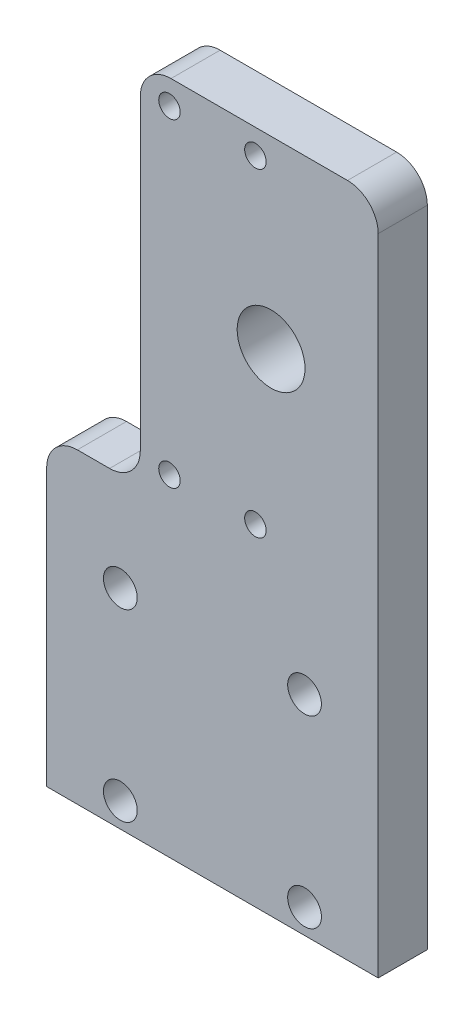
ISO-10303-21;
HEADER;
FILE_DESCRIPTION(('STEP AP214'),'2;1');
FILE_NAME('part.step','',(''),(''),'','','');
FILE_SCHEMA(('AUTOMOTIVE_DESIGN { 1 0 10303 214 1 1 1 1 }'));
ENDSEC;
DATA;
#1=APPLICATION_CONTEXT('core data for automotive mechanical design processes');
#2=APPLICATION_PROTOCOL_DEFINITION('international standard','automotive_design',2000,#1);
#3=PRODUCT_CONTEXT('',#1,'mechanical');
#4=PRODUCT('Part','Part','',(#3));
#5=PRODUCT_RELATED_PRODUCT_CATEGORY('part','',(#4));
#6=PRODUCT_DEFINITION_FORMATION('','',#4);
#7=PRODUCT_DEFINITION_CONTEXT('part definition',#1,'design');
#8=PRODUCT_DEFINITION('design','',#6,#7);
#9=PRODUCT_DEFINITION_SHAPE('','',#8);
#10=(LENGTH_UNIT() NAMED_UNIT(*) SI_UNIT(.MILLI.,.METRE.));
#11=(NAMED_UNIT(*) PLANE_ANGLE_UNIT() SI_UNIT($,.RADIAN.));
#12=(NAMED_UNIT(*) SI_UNIT($,.STERADIAN.) SOLID_ANGLE_UNIT());
#13=UNCERTAINTY_MEASURE_WITH_UNIT(LENGTH_MEASURE(1.E-05),#10,'distance_accuracy_value','');
#14=(GEOMETRIC_REPRESENTATION_CONTEXT(3) GLOBAL_UNCERTAINTY_ASSIGNED_CONTEXT((#13)) GLOBAL_UNIT_ASSIGNED_CONTEXT((#10,
#11,#12)) REPRESENTATION_CONTEXT('',''));
#15=CARTESIAN_POINT('',(0.,0.,0.));
#16=DIRECTION('',(0.,0.,1.));
#17=DIRECTION('',(1.,0.,0.));
#18=AXIS2_PLACEMENT_3D('',#15,#16,#17);
#19=CARTESIAN_POINT('',(0.,0.,8.));
#20=DIRECTION('',(0.,0.,1.));
#21=DIRECTION('',(1.,0.,0.));
#22=AXIS2_PLACEMENT_3D('',#19,#20,#21);
#23=PLANE('',#22);
#24=CARTESIAN_POINT('',(36.55,-30.,8.));
#25=DIRECTION('',(0.,0.,1.));
#26=DIRECTION('',(1.,0.,0.));
#27=AXIS2_PLACEMENT_3D('',#24,#25,#26);
#28=CIRCLE('',#27,5.525);
#29=CARTESIAN_POINT('',(42.075,-30.,8.));
#30=VERTEX_POINT('',#29);
#31=EDGE_CURVE('E291',#30,#30,#28,.T.);
#32=ORIENTED_EDGE('',*,*,#31,.F.);
#33=EDGE_LOOP('',(#32));
#34=FACE_BOUND('',#33,.T.);
#35=CARTESIAN_POINT('',(19.9999999999996,-56.,8.));
#36=DIRECTION('',(0.,0.,-1.));
#37=DIRECTION('',(-1.,0.,0.));
#38=AXIS2_PLACEMENT_3D('',#35,#36,#37);
#39=CIRCLE('',#38,1.75);
#40=CARTESIAN_POINT('',(18.2499999999996,-56.,8.));
#41=VERTEX_POINT('',#40);
#42=EDGE_CURVE('E290',#41,#41,#39,.T.);
#43=ORIENTED_EDGE('',*,*,#42,.T.);
#44=EDGE_LOOP('',(#43));
#45=FACE_BOUND('',#44,.T.);
#46=CARTESIAN_POINT('',(33.9999999999996,-56.0000000000001,8.));
#47=DIRECTION('',(0.,0.,-1.));
#48=DIRECTION('',(-1.,0.,0.));
#49=AXIS2_PLACEMENT_3D('',#46,#47,#48);
#50=CIRCLE('',#49,1.75);
#51=CARTESIAN_POINT('',(32.2499999999996,-56.0000000000001,8.));
#52=VERTEX_POINT('',#51);
#53=EDGE_CURVE('E297',#52,#52,#50,.T.);
#54=ORIENTED_EDGE('',*,*,#53,.T.);
#55=EDGE_LOOP('',(#54));
#56=FACE_BOUND('',#55,.T.);
#57=CARTESIAN_POINT('',(34.0000000000001,-4.0000000000001,8.));
#58=DIRECTION('',(0.,0.,-1.));
#59=DIRECTION('',(-1.,0.,0.));
#60=AXIS2_PLACEMENT_3D('',#57,#58,#59);
#61=CIRCLE('',#60,1.75);
#62=CARTESIAN_POINT('',(32.2500000000001,-4.0000000000001,8.));
#63=VERTEX_POINT('',#62);
#64=EDGE_CURVE('E284',#63,#63,#61,.T.);
#65=ORIENTED_EDGE('',*,*,#64,.T.);
#66=EDGE_LOOP('',(#65));
#67=FACE_BOUND('',#66,.T.);
#68=CARTESIAN_POINT('',(20.0000000000001,-4.,8.));
#69=DIRECTION('',(0.,0.,-1.));
#70=DIRECTION('',(-1.,0.,0.));
#71=AXIS2_PLACEMENT_3D('',#68,#69,#70);
#72=CIRCLE('',#71,1.75);
#73=CARTESIAN_POINT('',(18.2500000000001,-4.,8.));
#74=VERTEX_POINT('',#73);
#75=EDGE_CURVE('E185',#74,#74,#72,.T.);
#76=ORIENTED_EDGE('',*,*,#75,.T.);
#77=EDGE_LOOP('',(#76));
#78=FACE_BOUND('',#77,.T.);
#79=DIRECTION('',(1.,0.,0.));
#80=VECTOR('',#79,1.);
#81=CARTESIAN_POINT('',(0.,-60.,8.));
#82=LINE('',#81,#80);
#83=CARTESIAN_POINT('',(5.00000000000001,-60.,8.));
#84=VERTEX_POINT('',#83);
#85=CARTESIAN_POINT('',(10.25,-60.,8.));
#86=VERTEX_POINT('',#85);
#87=EDGE_CURVE('E189',#84,#86,#82,.T.);
#88=ORIENTED_EDGE('',*,*,#87,.F.);
#89=CARTESIAN_POINT('',(5.00000000000001,-65.,8.));
#90=DIRECTION('',(0.,0.,1.));
#91=DIRECTION('',(1.,0.,0.));
#92=AXIS2_PLACEMENT_3D('',#89,#90,#91);
#93=CIRCLE('',#92,5.);
#94=CARTESIAN_POINT('',(0.,-65.,8.));
#95=VERTEX_POINT('',#94);
#96=EDGE_CURVE('E119',#84,#95,#93,.T.);
#97=ORIENTED_EDGE('',*,*,#96,.T.);
#98=DIRECTION('',(0.,-1.,0.));
#99=VECTOR('',#98,1.);
#100=CARTESIAN_POINT('',(0.,0.,8.));
#101=LINE('',#100,#99);
#102=CARTESIAN_POINT('',(0.,-110.,8.));
#103=VERTEX_POINT('',#102);
#104=EDGE_CURVE('E111',#95,#103,#101,.T.);
#105=ORIENTED_EDGE('',*,*,#104,.T.);
#106=DIRECTION('',(1.,0.,0.));
#107=VECTOR('',#106,1.);
#108=CARTESIAN_POINT('',(0.,-110.,8.));
#109=LINE('',#108,#107);
#110=CARTESIAN_POINT('',(54.,-110.,8.));
#111=VERTEX_POINT('',#110);
#112=EDGE_CURVE('E116',#103,#111,#109,.T.);
#113=ORIENTED_EDGE('',*,*,#112,.T.);
#114=DIRECTION('',(0.,1.,0.));
#115=VECTOR('',#114,1.);
#116=CARTESIAN_POINT('',(54.,-52.,8.));
#117=LINE('',#116,#115);
#118=CARTESIAN_POINT('',(54.,-5.00000000000001,8.));
#119=VERTEX_POINT('',#118);
#120=EDGE_CURVE('E134',#111,#119,#117,.T.);
#121=ORIENTED_EDGE('',*,*,#120,.T.);
#122=CARTESIAN_POINT('',(49.,-5.,8.));
#123=DIRECTION('',(0.,0.,1.));
#124=DIRECTION('',(1.,0.,0.));
#125=AXIS2_PLACEMENT_3D('',#122,#123,#124);
#126=CIRCLE('',#125,5.);
#127=CARTESIAN_POINT('',(49.,0.,8.));
#128=VERTEX_POINT('',#127);
#129=EDGE_CURVE('E159',#119,#128,#126,.T.);
#130=ORIENTED_EDGE('',*,*,#129,.T.);
#131=DIRECTION('',(-1.,0.,0.));
#132=VECTOR('',#131,1.);
#133=CARTESIAN_POINT('',(0.,0.,8.));
#134=LINE('',#133,#132);
#135=CARTESIAN_POINT('',(20.25,0.,8.));
#136=VERTEX_POINT('',#135);
#137=EDGE_CURVE('E144',#128,#136,#134,.T.);
#138=ORIENTED_EDGE('',*,*,#137,.T.);
#139=CARTESIAN_POINT('',(20.25,-5.,8.));
#140=DIRECTION('',(0.,0.,1.));
#141=DIRECTION('',(1.,0.,0.));
#142=AXIS2_PLACEMENT_3D('',#139,#140,#141);
#143=CIRCLE('',#142,5.);
#144=CARTESIAN_POINT('',(15.25,-5.,8.));
#145=VERTEX_POINT('',#144);
#146=EDGE_CURVE('E51',#136,#145,#143,.T.);
#147=ORIENTED_EDGE('',*,*,#146,.T.);
#148=DIRECTION('',(0.,1.,0.));
#149=VECTOR('',#148,1.);
#150=CARTESIAN_POINT('',(15.25,0.,8.));
#151=LINE('',#150,#149);
#152=CARTESIAN_POINT('',(15.25,-55.,8.));
#153=VERTEX_POINT('',#152);
#154=EDGE_CURVE('E190',#153,#145,#151,.T.);
#155=ORIENTED_EDGE('',*,*,#154,.F.);
#156=CARTESIAN_POINT('',(10.25,-55.,8.));
#157=DIRECTION('',(0.,0.,1.));
#158=DIRECTION('',(1.,0.,0.));
#159=AXIS2_PLACEMENT_3D('',#156,#157,#158);
#160=CIRCLE('',#159,5.);
#161=EDGE_CURVE('E11',#153,#86,#160,.F.);
#162=ORIENTED_EDGE('',*,*,#161,.T.);
#163=EDGE_LOOP('',(#88,#97,#105,#113,#121,#130,#138,#147,#155,#162));
#164=FACE_BOUND('',#163,.T.);
#165=CARTESIAN_POINT('',(41.9999999999999,-76.,8.));
#166=DIRECTION('',(0.,0.,1.));
#167=DIRECTION('',(1.,0.,0.));
#168=AXIS2_PLACEMENT_3D('',#165,#166,#167);
#169=CIRCLE('',#168,2.75);
#170=CARTESIAN_POINT('',(44.7499999999999,-76.,8.));
#171=VERTEX_POINT('',#170);
#172=EDGE_CURVE('E205',#171,#171,#169,.T.);
#173=ORIENTED_EDGE('',*,*,#172,.F.);
#174=EDGE_LOOP('',(#173));
#175=FACE_BOUND('',#174,.T.);
#176=CARTESIAN_POINT('',(12.,-106.,8.));
#177=DIRECTION('',(0.,0.,1.));
#178=DIRECTION('',(1.,0.,0.));
#179=AXIS2_PLACEMENT_3D('',#176,#177,#178);
#180=CIRCLE('',#179,2.75);
#181=CARTESIAN_POINT('',(14.75,-106.,8.));
#182=VERTEX_POINT('',#181);
#183=EDGE_CURVE('E217',#182,#182,#180,.T.);
#184=ORIENTED_EDGE('',*,*,#183,.F.);
#185=EDGE_LOOP('',(#184));
#186=FACE_BOUND('',#185,.T.);
#187=CARTESIAN_POINT('',(42.,-106.,8.));
#188=DIRECTION('',(0.,0.,1.));
#189=DIRECTION('',(1.,0.,0.));
#190=AXIS2_PLACEMENT_3D('',#187,#188,#189);
#191=CIRCLE('',#190,2.75);
#192=CARTESIAN_POINT('',(44.75,-106.,8.));
#193=VERTEX_POINT('',#192);
#194=EDGE_CURVE('E211',#193,#193,#191,.T.);
#195=ORIENTED_EDGE('',*,*,#194,.F.);
#196=EDGE_LOOP('',(#195));
#197=FACE_BOUND('',#196,.T.);
#198=CARTESIAN_POINT('',(11.9999999999999,-76.,8.));
#199=DIRECTION('',(0.,0.,1.));
#200=DIRECTION('',(1.,0.,0.));
#201=AXIS2_PLACEMENT_3D('',#198,#199,#200);
#202=CIRCLE('',#201,2.75);
#203=CARTESIAN_POINT('',(14.7499999999999,-76.,8.));
#204=VERTEX_POINT('',#203);
#205=EDGE_CURVE('E197',#204,#204,#202,.T.);
#206=ORIENTED_EDGE('',*,*,#205,.F.);
#207=EDGE_LOOP('',(#206));
#208=FACE_BOUND('',#207,.T.);
#209=ADVANCED_FACE('F36',(#34,#45,#56,#67,#78,#164,#175,#186,#197,#208),#23,.T.);
#210=CARTESIAN_POINT('',(0.,0.,0.));
#211=DIRECTION('',(0.,0.,1.));
#212=DIRECTION('',(1.,0.,0.));
#213=AXIS2_PLACEMENT_3D('',#210,#211,#212);
#214=PLANE('',#213);
#215=CARTESIAN_POINT('',(36.55,-30.,0.));
#216=DIRECTION('',(0.,0.,-1.));
#217=DIRECTION('',(-1.,0.,0.));
#218=AXIS2_PLACEMENT_3D('',#215,#216,#217);
#219=CIRCLE('',#218,5.525);
#220=CARTESIAN_POINT('',(31.025,-30.,0.));
#221=VERTEX_POINT('',#220);
#222=EDGE_CURVE('E307',#221,#221,#219,.T.);
#223=ORIENTED_EDGE('',*,*,#222,.F.);
#224=EDGE_LOOP('',(#223));
#225=FACE_BOUND('',#224,.T.);
#226=CARTESIAN_POINT('',(19.9999999999996,-56.,0.));
#227=DIRECTION('',(0.,0.,-1.));
#228=DIRECTION('',(-1.,0.,0.));
#229=AXIS2_PLACEMENT_3D('',#226,#227,#228);
#230=CIRCLE('',#229,1.75);
#231=CARTESIAN_POINT('',(18.2499999999996,-56.,0.));
#232=VERTEX_POINT('',#231);
#233=EDGE_CURVE('E287',#232,#232,#230,.T.);
#234=ORIENTED_EDGE('',*,*,#233,.F.);
#235=EDGE_LOOP('',(#234));
#236=FACE_BOUND('',#235,.T.);
#237=CARTESIAN_POINT('',(33.9999999999996,-56.0000000000001,0.));
#238=DIRECTION('',(0.,0.,-1.));
#239=DIRECTION('',(-1.,0.,0.));
#240=AXIS2_PLACEMENT_3D('',#237,#238,#239);
#241=CIRCLE('',#240,1.75);
#242=CARTESIAN_POINT('',(32.2499999999996,-56.0000000000001,0.));
#243=VERTEX_POINT('',#242);
#244=EDGE_CURVE('E294',#243,#243,#241,.T.);
#245=ORIENTED_EDGE('',*,*,#244,.F.);
#246=EDGE_LOOP('',(#245));
#247=FACE_BOUND('',#246,.T.);
#248=CARTESIAN_POINT('',(34.0000000000001,-4.0000000000001,0.));
#249=DIRECTION('',(0.,0.,-1.));
#250=DIRECTION('',(-1.,0.,0.));
#251=AXIS2_PLACEMENT_3D('',#248,#249,#250);
#252=CIRCLE('',#251,1.75);
#253=CARTESIAN_POINT('',(32.2500000000001,-4.0000000000001,0.));
#254=VERTEX_POINT('',#253);
#255=EDGE_CURVE('E300',#254,#254,#252,.T.);
#256=ORIENTED_EDGE('',*,*,#255,.F.);
#257=EDGE_LOOP('',(#256));
#258=FACE_BOUND('',#257,.T.);
#259=CARTESIAN_POINT('',(20.0000000000001,-4.,0.));
#260=DIRECTION('',(0.,0.,-1.));
#261=DIRECTION('',(-1.,0.,0.));
#262=AXIS2_PLACEMENT_3D('',#259,#260,#261);
#263=CIRCLE('',#262,1.75);
#264=CARTESIAN_POINT('',(18.2500000000001,-4.,0.));
#265=VERTEX_POINT('',#264);
#266=EDGE_CURVE('E281',#265,#265,#263,.T.);
#267=ORIENTED_EDGE('',*,*,#266,.F.);
#268=EDGE_LOOP('',(#267));
#269=FACE_BOUND('',#268,.T.);
#270=DIRECTION('',(0.,-1.,0.));
#271=VECTOR('',#270,1.);
#272=CARTESIAN_POINT('',(0.,0.,0.));
#273=LINE('',#272,#271);
#274=CARTESIAN_POINT('',(0.,-65.,0.));
#275=VERTEX_POINT('',#274);
#276=CARTESIAN_POINT('',(0.,-110.,0.));
#277=VERTEX_POINT('',#276);
#278=EDGE_CURVE('E138',#275,#277,#273,.T.);
#279=ORIENTED_EDGE('',*,*,#278,.F.);
#280=CARTESIAN_POINT('',(5.00000000000001,-65.,0.));
#281=DIRECTION('',(0.,0.,1.));
#282=DIRECTION('',(1.,0.,0.));
#283=AXIS2_PLACEMENT_3D('',#280,#281,#282);
#284=CIRCLE('',#283,5.);
#285=CARTESIAN_POINT('',(5.00000000000001,-60.,0.));
#286=VERTEX_POINT('',#285);
#287=EDGE_CURVE('E151',#275,#286,#284,.F.);
#288=ORIENTED_EDGE('',*,*,#287,.T.);
#289=DIRECTION('',(-1.,0.,0.));
#290=VECTOR('',#289,1.);
#291=CARTESIAN_POINT('',(15.25,-60.,0.));
#292=LINE('',#291,#290);
#293=CARTESIAN_POINT('',(10.25,-60.,0.));
#294=VERTEX_POINT('',#293);
#295=EDGE_CURVE('E180',#294,#286,#292,.T.);
#296=ORIENTED_EDGE('',*,*,#295,.F.);
#297=CARTESIAN_POINT('',(10.25,-55.,0.));
#298=DIRECTION('',(0.,0.,1.));
#299=DIRECTION('',(1.,0.,0.));
#300=AXIS2_PLACEMENT_3D('',#297,#298,#299);
#301=CIRCLE('',#300,5.);
#302=CARTESIAN_POINT('',(15.25,-55.,0.));
#303=VERTEX_POINT('',#302);
#304=EDGE_CURVE('E44',#294,#303,#301,.T.);
#305=ORIENTED_EDGE('',*,*,#304,.T.);
#306=DIRECTION('',(0.,-1.,0.));
#307=VECTOR('',#306,1.);
#308=CARTESIAN_POINT('',(15.25,0.,0.));
#309=LINE('',#308,#307);
#310=CARTESIAN_POINT('',(15.25,-5.,0.));
#311=VERTEX_POINT('',#310);
#312=EDGE_CURVE('E177',#311,#303,#309,.T.);
#313=ORIENTED_EDGE('',*,*,#312,.F.);
#314=CARTESIAN_POINT('',(20.25,-5.,0.));
#315=DIRECTION('',(0.,0.,1.));
#316=DIRECTION('',(1.,0.,0.));
#317=AXIS2_PLACEMENT_3D('',#314,#315,#316);
#318=CIRCLE('',#317,5.);
#319=CARTESIAN_POINT('',(20.25,0.,0.));
#320=VERTEX_POINT('',#319);
#321=EDGE_CURVE('E142',#311,#320,#318,.F.);
#322=ORIENTED_EDGE('',*,*,#321,.T.);
#323=DIRECTION('',(-1.,0.,0.));
#324=VECTOR('',#323,1.);
#325=CARTESIAN_POINT('',(0.,0.,0.));
#326=LINE('',#325,#324);
#327=CARTESIAN_POINT('',(49.,0.,0.));
#328=VERTEX_POINT('',#327);
#329=EDGE_CURVE('E124',#328,#320,#326,.T.);
#330=ORIENTED_EDGE('',*,*,#329,.F.);
#331=CARTESIAN_POINT('',(49.,-5.,0.));
#332=DIRECTION('',(0.,0.,1.));
#333=DIRECTION('',(1.,0.,0.));
#334=AXIS2_PLACEMENT_3D('',#331,#332,#333);
#335=CIRCLE('',#334,5.);
#336=CARTESIAN_POINT('',(54.,-5.00000000000001,0.));
#337=VERTEX_POINT('',#336);
#338=EDGE_CURVE('E149',#328,#337,#335,.F.);
#339=ORIENTED_EDGE('',*,*,#338,.T.);
#340=DIRECTION('',(0.,1.,0.));
#341=VECTOR('',#340,1.);
#342=CARTESIAN_POINT('',(54.,-52.,0.));
#343=LINE('',#342,#341);
#344=CARTESIAN_POINT('',(54.,-110.,0.));
#345=VERTEX_POINT('',#344);
#346=EDGE_CURVE('E227',#345,#337,#343,.T.);
#347=ORIENTED_EDGE('',*,*,#346,.F.);
#348=DIRECTION('',(1.,0.,0.));
#349=VECTOR('',#348,1.);
#350=CARTESIAN_POINT('',(0.,-110.,0.));
#351=LINE('',#350,#349);
#352=EDGE_CURVE('E225',#277,#345,#351,.T.);
#353=ORIENTED_EDGE('',*,*,#352,.F.);
#354=EDGE_LOOP('',(#279,#288,#296,#305,#313,#322,#330,#339,#347,#353));
#355=FACE_BOUND('',#354,.T.);
#356=CARTESIAN_POINT('',(12.,-106.,0.));
#357=DIRECTION('',(0.,0.,1.));
#358=DIRECTION('',(1.,0.,0.));
#359=AXIS2_PLACEMENT_3D('',#356,#357,#358);
#360=CIRCLE('',#359,2.75);
#361=CARTESIAN_POINT('',(14.75,-106.,0.));
#362=VERTEX_POINT('',#361);
#363=EDGE_CURVE('E214',#362,#362,#360,.T.);
#364=ORIENTED_EDGE('',*,*,#363,.T.);
#365=EDGE_LOOP('',(#364));
#366=FACE_BOUND('',#365,.T.);
#367=CARTESIAN_POINT('',(42.,-106.,0.));
#368=DIRECTION('',(0.,0.,1.));
#369=DIRECTION('',(1.,0.,0.));
#370=AXIS2_PLACEMENT_3D('',#367,#368,#369);
#371=CIRCLE('',#370,2.75);
#372=CARTESIAN_POINT('',(44.75,-106.,0.));
#373=VERTEX_POINT('',#372);
#374=EDGE_CURVE('E208',#373,#373,#371,.T.);
#375=ORIENTED_EDGE('',*,*,#374,.T.);
#376=EDGE_LOOP('',(#375));
#377=FACE_BOUND('',#376,.T.);
#378=CARTESIAN_POINT('',(41.9999999999999,-76.,0.));
#379=DIRECTION('',(0.,0.,1.));
#380=DIRECTION('',(1.,0.,0.));
#381=AXIS2_PLACEMENT_3D('',#378,#379,#380);
#382=CIRCLE('',#381,2.75);
#383=CARTESIAN_POINT('',(44.7499999999999,-76.,0.));
#384=VERTEX_POINT('',#383);
#385=EDGE_CURVE('E203',#384,#384,#382,.T.);
#386=ORIENTED_EDGE('',*,*,#385,.T.);
#387=EDGE_LOOP('',(#386));
#388=FACE_BOUND('',#387,.T.);
#389=CARTESIAN_POINT('',(11.9999999999999,-76.,0.));
#390=DIRECTION('',(0.,0.,1.));
#391=DIRECTION('',(1.,0.,0.));
#392=AXIS2_PLACEMENT_3D('',#389,#390,#391);
#393=CIRCLE('',#392,2.75);
#394=CARTESIAN_POINT('',(14.7499999999999,-76.,0.));
#395=VERTEX_POINT('',#394);
#396=EDGE_CURVE('E194',#395,#395,#393,.T.);
#397=ORIENTED_EDGE('',*,*,#396,.T.);
#398=EDGE_LOOP('',(#397));
#399=FACE_BOUND('',#398,.T.);
#400=ADVANCED_FACE('F175',(#225,#236,#247,#258,#269,#355,#366,#377,#388,#399),#214,.F.);
#401=CARTESIAN_POINT('',(0.,0.,8.));
#402=DIRECTION('',(1.,0.,0.));
#403=DIRECTION('',(0.,1.,0.));
#404=AXIS2_PLACEMENT_3D('',#401,#402,#403);
#405=PLANE('',#404);
#406=ORIENTED_EDGE('',*,*,#104,.F.);
#407=DIRECTION('',(0.,0.,-1.));
#408=VECTOR('',#407,1.);
#409=CARTESIAN_POINT('',(0.,-65.,8.));
#410=LINE('',#409,#408);
#411=EDGE_CURVE('E140',#95,#275,#410,.T.);
#412=ORIENTED_EDGE('',*,*,#411,.T.);
#413=ORIENTED_EDGE('',*,*,#278,.T.);
#414=DIRECTION('',(0.,0.,-1.));
#415=VECTOR('',#414,1.);
#416=CARTESIAN_POINT('',(0.,-110.,8.));
#417=LINE('',#416,#415);
#418=EDGE_CURVE('E130',#103,#277,#417,.T.);
#419=ORIENTED_EDGE('',*,*,#418,.F.);
#420=EDGE_LOOP('',(#406,#412,#413,#419));
#421=FACE_BOUND('',#420,.T.);
#422=ADVANCED_FACE('F136',(#421),#405,.F.);
#423=CARTESIAN_POINT('',(0.,-110.,8.));
#424=DIRECTION('',(0.,1.,0.));
#425=DIRECTION('',(0.,0.,1.));
#426=AXIS2_PLACEMENT_3D('',#423,#424,#425);
#427=PLANE('',#426);
#428=ORIENTED_EDGE('',*,*,#352,.T.);
#429=DIRECTION('',(0.,0.,-1.));
#430=VECTOR('',#429,1.);
#431=CARTESIAN_POINT('',(54.,-110.,8.));
#432=LINE('',#431,#430);
#433=EDGE_CURVE('E132',#111,#345,#432,.T.);
#434=ORIENTED_EDGE('',*,*,#433,.F.);
#435=ORIENTED_EDGE('',*,*,#112,.F.);
#436=ORIENTED_EDGE('',*,*,#418,.T.);
#437=EDGE_LOOP('',(#428,#434,#435,#436));
#438=FACE_BOUND('',#437,.T.);
#439=ADVANCED_FACE('F129',(#438),#427,.F.);
#440=CARTESIAN_POINT('',(54.,-52.,8.));
#441=DIRECTION('',(-1.,0.,0.));
#442=DIRECTION('',(0.,-1.,0.));
#443=AXIS2_PLACEMENT_3D('',#440,#441,#442);
#444=PLANE('',#443);
#445=ORIENTED_EDGE('',*,*,#346,.T.);
#446=DIRECTION('',(0.,0.,-1.));
#447=VECTOR('',#446,1.);
#448=CARTESIAN_POINT('',(54.,-5.,8.));
#449=LINE('',#448,#447);
#450=EDGE_CURVE('E168',#337,#119,#449,.F.);
#451=ORIENTED_EDGE('',*,*,#450,.T.);
#452=ORIENTED_EDGE('',*,*,#120,.F.);
#453=ORIENTED_EDGE('',*,*,#433,.T.);
#454=EDGE_LOOP('',(#445,#451,#452,#453));
#455=FACE_BOUND('',#454,.T.);
#456=ADVANCED_FACE('F264',(#455),#444,.F.);
#457=CARTESIAN_POINT('',(0.,0.,8.));
#458=DIRECTION('',(0.,-1.,0.));
#459=DIRECTION('',(0.,0.,-1.));
#460=AXIS2_PLACEMENT_3D('',#457,#458,#459);
#461=PLANE('',#460);
#462=ORIENTED_EDGE('',*,*,#137,.F.);
#463=DIRECTION('',(0.,0.,-1.));
#464=VECTOR('',#463,1.);
#465=CARTESIAN_POINT('',(49.,0.,8.));
#466=LINE('',#465,#464);
#467=EDGE_CURVE('E165',#128,#328,#466,.T.);
#468=ORIENTED_EDGE('',*,*,#467,.T.);
#469=ORIENTED_EDGE('',*,*,#329,.T.);
#470=DIRECTION('',(0.,0.,1.));
#471=VECTOR('',#470,1.);
#472=CARTESIAN_POINT('',(20.25,0.,8.));
#473=LINE('',#472,#471);
#474=EDGE_CURVE('E162',#320,#136,#473,.T.);
#475=ORIENTED_EDGE('',*,*,#474,.T.);
#476=EDGE_LOOP('',(#462,#468,#469,#475));
#477=FACE_BOUND('',#476,.T.);
#478=ADVANCED_FACE('F234',(#477),#461,.F.);
#479=CARTESIAN_POINT('',(12.,-106.,8.));
#480=DIRECTION('',(0.,0.,-1.));
#481=DIRECTION('',(-1.,0.,0.));
#482=AXIS2_PLACEMENT_3D('',#479,#480,#481);
#483=CYLINDRICAL_SURFACE('',#482,2.75);
#484=ORIENTED_EDGE('',*,*,#183,.T.);
#485=EDGE_LOOP('',(#484));
#486=FACE_BOUND('',#485,.T.);
#487=ORIENTED_EDGE('',*,*,#363,.F.);
#488=EDGE_LOOP('',(#487));
#489=FACE_BOUND('',#488,.T.);
#490=ADVANCED_FACE('F259',(#486,#489),#483,.F.);
#491=CARTESIAN_POINT('',(42.,-106.,8.));
#492=DIRECTION('',(0.,0.,-1.));
#493=DIRECTION('',(-1.,0.,0.));
#494=AXIS2_PLACEMENT_3D('',#491,#492,#493);
#495=CYLINDRICAL_SURFACE('',#494,2.75);
#496=ORIENTED_EDGE('',*,*,#194,.T.);
#497=EDGE_LOOP('',(#496));
#498=FACE_BOUND('',#497,.T.);
#499=ORIENTED_EDGE('',*,*,#374,.F.);
#500=EDGE_LOOP('',(#499));
#501=FACE_BOUND('',#500,.T.);
#502=ADVANCED_FACE('F344',(#498,#501),#495,.F.);
#503=CARTESIAN_POINT('',(41.9999999999999,-76.,8.));
#504=DIRECTION('',(0.,0.,-1.));
#505=DIRECTION('',(-1.,0.,0.));
#506=AXIS2_PLACEMENT_3D('',#503,#504,#505);
#507=CYLINDRICAL_SURFACE('',#506,2.75);
#508=ORIENTED_EDGE('',*,*,#172,.T.);
#509=EDGE_LOOP('',(#508));
#510=FACE_BOUND('',#509,.T.);
#511=ORIENTED_EDGE('',*,*,#385,.F.);
#512=EDGE_LOOP('',(#511));
#513=FACE_BOUND('',#512,.T.);
#514=ADVANCED_FACE('F341',(#510,#513),#507,.F.);
#515=CARTESIAN_POINT('',(11.9999999999999,-76.,8.));
#516=DIRECTION('',(0.,0.,-1.));
#517=DIRECTION('',(-1.,0.,0.));
#518=AXIS2_PLACEMENT_3D('',#515,#516,#517);
#519=CYLINDRICAL_SURFACE('',#518,2.75);
#520=ORIENTED_EDGE('',*,*,#205,.T.);
#521=EDGE_LOOP('',(#520));
#522=FACE_BOUND('',#521,.T.);
#523=ORIENTED_EDGE('',*,*,#396,.F.);
#524=EDGE_LOOP('',(#523));
#525=FACE_BOUND('',#524,.T.);
#526=ADVANCED_FACE('F337',(#522,#525),#519,.F.);
#527=CARTESIAN_POINT('',(15.25,-60.,10.));
#528=DIRECTION('',(0.,-1.,0.));
#529=DIRECTION('',(0.,0.,-1.));
#530=AXIS2_PLACEMENT_3D('',#527,#528,#529);
#531=PLANE('',#530);
#532=ORIENTED_EDGE('',*,*,#295,.T.);
#533=DIRECTION('',(0.,0.,-1.));
#534=VECTOR('',#533,1.);
#535=CARTESIAN_POINT('',(5.00000000000001,-60.,10.));
#536=LINE('',#535,#534);
#537=EDGE_CURVE('E156',#286,#84,#536,.F.);
#538=ORIENTED_EDGE('',*,*,#537,.T.);
#539=ORIENTED_EDGE('',*,*,#87,.T.);
#540=DIRECTION('',(0.,0.,-1.));
#541=VECTOR('',#540,1.);
#542=CARTESIAN_POINT('',(10.25,-60.,0.));
#543=LINE('',#542,#541);
#544=EDGE_CURVE('E153',#86,#294,#543,.T.);
#545=ORIENTED_EDGE('',*,*,#544,.T.);
#546=EDGE_LOOP('',(#532,#538,#539,#545));
#547=FACE_BOUND('',#546,.T.);
#548=ADVANCED_FACE('F192',(#547),#531,.F.);
#549=CARTESIAN_POINT('',(15.25,0.,10.));
#550=DIRECTION('',(1.,0.,0.));
#551=DIRECTION('',(0.,1.,0.));
#552=AXIS2_PLACEMENT_3D('',#549,#550,#551);
#553=PLANE('',#552);
#554=ORIENTED_EDGE('',*,*,#154,.T.);
#555=DIRECTION('',(0.,0.,1.));
#556=VECTOR('',#555,1.);
#557=CARTESIAN_POINT('',(15.25,-5.,10.));
#558=LINE('',#557,#556);
#559=EDGE_CURVE('E171',#145,#311,#558,.F.);
#560=ORIENTED_EDGE('',*,*,#559,.T.);
#561=ORIENTED_EDGE('',*,*,#312,.T.);
#562=DIRECTION('',(0.,0.,-1.));
#563=VECTOR('',#562,1.);
#564=CARTESIAN_POINT('',(15.25,-55.,8.));
#565=LINE('',#564,#563);
#566=EDGE_CURVE('E58',#303,#153,#565,.F.);
#567=ORIENTED_EDGE('',*,*,#566,.T.);
#568=EDGE_LOOP('',(#554,#560,#561,#567));
#569=FACE_BOUND('',#568,.T.);
#570=ADVANCED_FACE('F183',(#569),#553,.F.);
#571=CARTESIAN_POINT('',(5.00000000000001,-65.,8.));
#572=DIRECTION('',(0.,0.,-1.));
#573=DIRECTION('',(-1.,0.,0.));
#574=AXIS2_PLACEMENT_3D('',#571,#572,#573);
#575=CYLINDRICAL_SURFACE('',#574,5.);
#576=ORIENTED_EDGE('',*,*,#96,.F.);
#577=ORIENTED_EDGE('',*,*,#537,.F.);
#578=ORIENTED_EDGE('',*,*,#287,.F.);
#579=ORIENTED_EDGE('',*,*,#411,.F.);
#580=EDGE_LOOP('',(#576,#577,#578,#579));
#581=FACE_BOUND('',#580,.T.);
#582=ADVANCED_FACE('F245',(#581),#575,.T.);
#583=CARTESIAN_POINT('',(49.,-5.,8.));
#584=DIRECTION('',(0.,0.,-1.));
#585=DIRECTION('',(-1.,0.,0.));
#586=AXIS2_PLACEMENT_3D('',#583,#584,#585);
#587=CYLINDRICAL_SURFACE('',#586,5.);
#588=ORIENTED_EDGE('',*,*,#129,.F.);
#589=ORIENTED_EDGE('',*,*,#450,.F.);
#590=ORIENTED_EDGE('',*,*,#338,.F.);
#591=ORIENTED_EDGE('',*,*,#467,.F.);
#592=EDGE_LOOP('',(#588,#589,#590,#591));
#593=FACE_BOUND('',#592,.T.);
#594=ADVANCED_FACE('F239',(#593),#587,.T.);
#595=CARTESIAN_POINT('',(20.25,-5.,8.));
#596=DIRECTION('',(0.,0.,1.));
#597=DIRECTION('',(1.,0.,0.));
#598=AXIS2_PLACEMENT_3D('',#595,#596,#597);
#599=CYLINDRICAL_SURFACE('',#598,5.);
#600=ORIENTED_EDGE('',*,*,#321,.F.);
#601=ORIENTED_EDGE('',*,*,#559,.F.);
#602=ORIENTED_EDGE('',*,*,#146,.F.);
#603=ORIENTED_EDGE('',*,*,#474,.F.);
#604=EDGE_LOOP('',(#600,#601,#602,#603));
#605=FACE_BOUND('',#604,.T.);
#606=ADVANCED_FACE('F237',(#605),#599,.T.);
#607=CARTESIAN_POINT('',(10.25,-55.,10.));
#608=DIRECTION('',(0.,0.,1.));
#609=DIRECTION('',(1.,0.,0.));
#610=AXIS2_PLACEMENT_3D('',#607,#608,#609);
#611=CYLINDRICAL_SURFACE('',#610,5.);
#612=ORIENTED_EDGE('',*,*,#161,.F.);
#613=ORIENTED_EDGE('',*,*,#566,.F.);
#614=ORIENTED_EDGE('',*,*,#304,.F.);
#615=ORIENTED_EDGE('',*,*,#544,.F.);
#616=EDGE_LOOP('',(#612,#613,#614,#615));
#617=FACE_BOUND('',#616,.T.);
#618=ADVANCED_FACE('F38',(#617),#611,.F.);
#619=CARTESIAN_POINT('',(20.0000000000001,-4.,8.));
#620=DIRECTION('',(0.,0.,-1.));
#621=DIRECTION('',(-1.,0.,0.));
#622=AXIS2_PLACEMENT_3D('',#619,#620,#621);
#623=CYLINDRICAL_SURFACE('',#622,1.75);
#624=ORIENTED_EDGE('',*,*,#75,.F.);
#625=EDGE_LOOP('',(#624));
#626=FACE_BOUND('',#625,.T.);
#627=ORIENTED_EDGE('',*,*,#266,.T.);
#628=EDGE_LOOP('',(#627));
#629=FACE_BOUND('',#628,.T.);
#630=ADVANCED_FACE('F244',(#626,#629),#623,.F.);
#631=CARTESIAN_POINT('',(34.0000000000001,-4.0000000000001,8.));
#632=DIRECTION('',(0.,0.,-1.));
#633=DIRECTION('',(-1.,0.,0.));
#634=AXIS2_PLACEMENT_3D('',#631,#632,#633);
#635=CYLINDRICAL_SURFACE('',#634,1.75);
#636=ORIENTED_EDGE('',*,*,#64,.F.);
#637=EDGE_LOOP('',(#636));
#638=FACE_BOUND('',#637,.T.);
#639=ORIENTED_EDGE('',*,*,#255,.T.);
#640=EDGE_LOOP('',(#639));
#641=FACE_BOUND('',#640,.T.);
#642=ADVANCED_FACE('F322',(#638,#641),#635,.F.);
#643=CARTESIAN_POINT('',(33.9999999999996,-56.0000000000001,8.));
#644=DIRECTION('',(0.,0.,-1.));
#645=DIRECTION('',(-1.,0.,0.));
#646=AXIS2_PLACEMENT_3D('',#643,#644,#645);
#647=CYLINDRICAL_SURFACE('',#646,1.75);
#648=ORIENTED_EDGE('',*,*,#53,.F.);
#649=EDGE_LOOP('',(#648));
#650=FACE_BOUND('',#649,.T.);
#651=ORIENTED_EDGE('',*,*,#244,.T.);
#652=EDGE_LOOP('',(#651));
#653=FACE_BOUND('',#652,.T.);
#654=ADVANCED_FACE('F328',(#650,#653),#647,.F.);
#655=CARTESIAN_POINT('',(19.9999999999996,-56.,8.));
#656=DIRECTION('',(0.,0.,-1.));
#657=DIRECTION('',(-1.,0.,0.));
#658=AXIS2_PLACEMENT_3D('',#655,#656,#657);
#659=CYLINDRICAL_SURFACE('',#658,1.75);
#660=ORIENTED_EDGE('',*,*,#42,.F.);
#661=EDGE_LOOP('',(#660));
#662=FACE_BOUND('',#661,.T.);
#663=ORIENTED_EDGE('',*,*,#233,.T.);
#664=EDGE_LOOP('',(#663));
#665=FACE_BOUND('',#664,.T.);
#666=ADVANCED_FACE('F334',(#662,#665),#659,.F.);
#667=CARTESIAN_POINT('',(36.55,-30.,10.));
#668=DIRECTION('',(0.,0.,-1.));
#669=DIRECTION('',(-1.,0.,0.));
#670=AXIS2_PLACEMENT_3D('',#667,#668,#669);
#671=CYLINDRICAL_SURFACE('',#670,5.525);
#672=ORIENTED_EDGE('',*,*,#31,.T.);
#673=EDGE_LOOP('',(#672));
#674=FACE_BOUND('',#673,.T.);
#675=ORIENTED_EDGE('',*,*,#222,.T.);
#676=EDGE_LOOP('',(#675));
#677=FACE_BOUND('',#676,.T.);
#678=ADVANCED_FACE('F311',(#674,#677),#671,.F.);
#679=CLOSED_SHELL('',(#209,#400,#422,#439,#456,#478,#490,#502,#514,#526,#548,#570,#582,#594,
#606,#618,#630,#642,#654,#666,#678));
#680=MANIFOLD_SOLID_BREP('B2',#679);
#681=ADVANCED_BREP_SHAPE_REPRESENTATION('',(#18,#680),#14);
#682=SHAPE_DEFINITION_REPRESENTATION(#9,#681);
ENDSEC;
END-ISO-10303-21;
